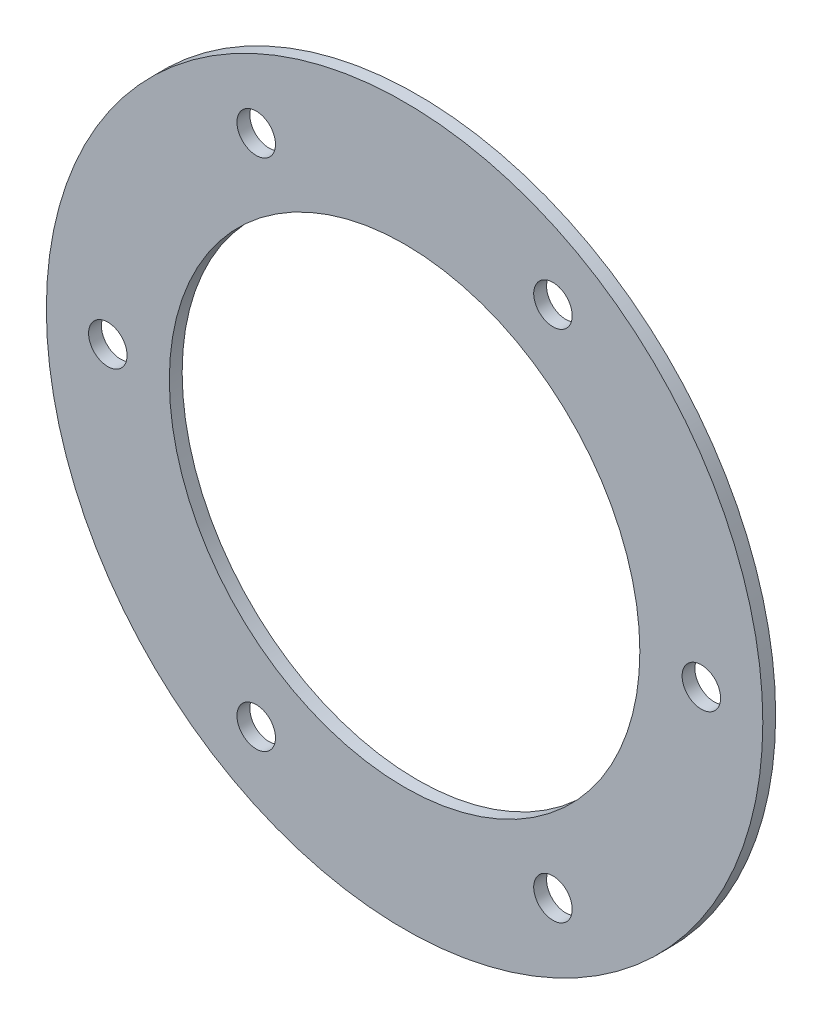
ISO-10303-21;
HEADER;
FILE_DESCRIPTION(('STEP AP214'),'2;1');
FILE_NAME('part.step','',(''),(''),'','','');
FILE_SCHEMA(('AUTOMOTIVE_DESIGN { 1 0 10303 214 1 1 1 1 }'));
ENDSEC;
DATA;
#1=APPLICATION_CONTEXT('core data for automotive mechanical design processes');
#2=APPLICATION_PROTOCOL_DEFINITION('international standard','automotive_design',2000,#1);
#3=PRODUCT_CONTEXT('',#1,'mechanical');
#4=PRODUCT('Part','Part','',(#3));
#5=PRODUCT_RELATED_PRODUCT_CATEGORY('part','',(#4));
#6=PRODUCT_DEFINITION_FORMATION('','',#4);
#7=PRODUCT_DEFINITION_CONTEXT('part definition',#1,'design');
#8=PRODUCT_DEFINITION('design','',#6,#7);
#9=PRODUCT_DEFINITION_SHAPE('','',#8);
#10=(LENGTH_UNIT() NAMED_UNIT(*) SI_UNIT(.MILLI.,.METRE.));
#11=(NAMED_UNIT(*) PLANE_ANGLE_UNIT() SI_UNIT($,.RADIAN.));
#12=(NAMED_UNIT(*) SI_UNIT($,.STERADIAN.) SOLID_ANGLE_UNIT());
#13=UNCERTAINTY_MEASURE_WITH_UNIT(LENGTH_MEASURE(1.E-05),#10,'distance_accuracy_value','');
#14=(GEOMETRIC_REPRESENTATION_CONTEXT(3) GLOBAL_UNCERTAINTY_ASSIGNED_CONTEXT((#13)) GLOBAL_UNIT_ASSIGNED_CONTEXT((#10,
#11,#12)) REPRESENTATION_CONTEXT('',''));
#15=CARTESIAN_POINT('',(0.,0.,0.));
#16=DIRECTION('',(0.,0.,1.));
#17=DIRECTION('',(1.,0.,0.));
#18=AXIS2_PLACEMENT_3D('',#15,#16,#17);
#19=CARTESIAN_POINT('',(0.,0.,6.));
#20=DIRECTION('',(0.,0.,1.));
#21=DIRECTION('',(1.,0.,0.));
#22=AXIS2_PLACEMENT_3D('',#19,#20,#21);
#23=PLANE('',#22);
#24=CARTESIAN_POINT('',(-138.75,7.84203431358765E-13,6.));
#25=DIRECTION('',(0.,0.,1.));
#26=DIRECTION('',(1.,0.,0.));
#27=AXIS2_PLACEMENT_3D('',#24,#25,#26);
#28=CIRCLE('',#27,9.00000000000001);
#29=CARTESIAN_POINT('',(-129.75,7.84203431358765E-13,6.));
#30=VERTEX_POINT('',#29);
#31=EDGE_CURVE('E66',#30,#30,#28,.T.);
#32=ORIENTED_EDGE('',*,*,#31,.F.);
#33=EDGE_LOOP('',(#32));
#34=FACE_BOUND('',#33,.T.);
#35=CARTESIAN_POINT('',(-69.3750000000006,-120.161024775091,6.));
#36=DIRECTION('',(0.,0.,1.));
#37=DIRECTION('',(1.,0.,0.));
#38=AXIS2_PLACEMENT_3D('',#35,#36,#37);
#39=CIRCLE('',#38,9.00000000000001);
#40=CARTESIAN_POINT('',(-60.3750000000006,-120.161024775091,6.));
#41=VERTEX_POINT('',#40);
#42=EDGE_CURVE('E72',#41,#41,#39,.T.);
#43=ORIENTED_EDGE('',*,*,#42,.F.);
#44=EDGE_LOOP('',(#43));
#45=FACE_BOUND('',#44,.T.);
#46=CARTESIAN_POINT('',(69.3749999999993,-120.161024775091,6.));
#47=DIRECTION('',(0.,0.,1.));
#48=DIRECTION('',(1.,0.,0.));
#49=AXIS2_PLACEMENT_3D('',#46,#47,#48);
#50=CIRCLE('',#49,9.00000000000001);
#51=CARTESIAN_POINT('',(78.3749999999993,-120.161024775091,6.));
#52=VERTEX_POINT('',#51);
#53=EDGE_CURVE('E78',#52,#52,#50,.T.);
#54=ORIENTED_EDGE('',*,*,#53,.F.);
#55=EDGE_LOOP('',(#54));
#56=FACE_BOUND('',#55,.T.);
#57=CARTESIAN_POINT('',(138.75,-7.51243685315206E-13,6.));
#58=DIRECTION('',(0.,0.,1.));
#59=DIRECTION('',(1.,0.,0.));
#60=AXIS2_PLACEMENT_3D('',#57,#58,#59);
#61=CIRCLE('',#60,9.00000000000004);
#62=CARTESIAN_POINT('',(147.75,-7.51243685315206E-13,6.));
#63=VERTEX_POINT('',#62);
#64=EDGE_CURVE('E84',#63,#63,#61,.T.);
#65=ORIENTED_EDGE('',*,*,#64,.F.);
#66=EDGE_LOOP('',(#65));
#67=FACE_BOUND('',#66,.T.);
#68=CARTESIAN_POINT('',(69.3750000000007,120.16102477509,6.));
#69=DIRECTION('',(0.,0.,1.));
#70=DIRECTION('',(1.,0.,0.));
#71=AXIS2_PLACEMENT_3D('',#68,#69,#70);
#72=CIRCLE('',#71,8.99999999999999);
#73=CARTESIAN_POINT('',(78.3750000000007,120.16102477509,6.));
#74=VERTEX_POINT('',#73);
#75=EDGE_CURVE('E90',#74,#74,#72,.T.);
#76=ORIENTED_EDGE('',*,*,#75,.F.);
#77=EDGE_LOOP('',(#76));
#78=FACE_BOUND('',#77,.T.);
#79=CARTESIAN_POINT('',(-69.3749999999993,120.161024775091,6.));
#80=DIRECTION('',(0.,0.,1.));
#81=DIRECTION('',(1.,0.,0.));
#82=AXIS2_PLACEMENT_3D('',#79,#80,#81);
#83=CIRCLE('',#82,9.00000000000001);
#84=CARTESIAN_POINT('',(-60.3749999999993,120.161024775091,6.));
#85=VERTEX_POINT('',#84);
#86=EDGE_CURVE('E60',#85,#85,#83,.T.);
#87=ORIENTED_EDGE('',*,*,#86,.F.);
#88=EDGE_LOOP('',(#87));
#89=FACE_BOUND('',#88,.T.);
#90=CARTESIAN_POINT('',(0.,0.,6.));
#91=DIRECTION('',(0.,0.,1.));
#92=DIRECTION('',(1.,0.,0.));
#93=AXIS2_PLACEMENT_3D('',#90,#91,#92);
#94=CIRCLE('',#93,167.5);
#95=CARTESIAN_POINT('',(167.5,0.,6.));
#96=VERTEX_POINT('',#95);
#97=EDGE_CURVE('E10',#96,#96,#94,.T.);
#98=ORIENTED_EDGE('',*,*,#97,.T.);
#99=EDGE_LOOP('',(#98));
#100=FACE_BOUND('',#99,.T.);
#101=CARTESIAN_POINT('',(0.,0.,6.));
#102=DIRECTION('',(0.,0.,1.));
#103=DIRECTION('',(1.,0.,0.));
#104=AXIS2_PLACEMENT_3D('',#101,#102,#103);
#105=CIRCLE('',#104,110.);
#106=CARTESIAN_POINT('',(110.,0.,6.));
#107=VERTEX_POINT('',#106);
#108=EDGE_CURVE('E52',#107,#107,#105,.T.);
#109=ORIENTED_EDGE('',*,*,#108,.F.);
#110=EDGE_LOOP('',(#109));
#111=FACE_BOUND('',#110,.T.);
#112=ADVANCED_FACE('F41',(#34,#45,#56,#67,#78,#89,#100,#111),#23,.T.);
#113=CARTESIAN_POINT('',(0.,0.,0.));
#114=DIRECTION('',(0.,0.,1.));
#115=DIRECTION('',(1.,0.,0.));
#116=AXIS2_PLACEMENT_3D('',#113,#114,#115);
#117=PLANE('',#116);
#118=CARTESIAN_POINT('',(-138.75,7.84203431358765E-13,0.));
#119=DIRECTION('',(0.,0.,1.));
#120=DIRECTION('',(1.,0.,0.));
#121=AXIS2_PLACEMENT_3D('',#118,#119,#120);
#122=CIRCLE('',#121,9.00000000000001);
#123=CARTESIAN_POINT('',(-129.75,7.84203431358765E-13,0.));
#124=VERTEX_POINT('',#123);
#125=EDGE_CURVE('E69',#124,#124,#122,.T.);
#126=ORIENTED_EDGE('',*,*,#125,.T.);
#127=EDGE_LOOP('',(#126));
#128=FACE_BOUND('',#127,.T.);
#129=CARTESIAN_POINT('',(-69.3750000000006,-120.161024775091,0.));
#130=DIRECTION('',(0.,0.,1.));
#131=DIRECTION('',(1.,0.,0.));
#132=AXIS2_PLACEMENT_3D('',#129,#130,#131);
#133=CIRCLE('',#132,9.00000000000001);
#134=CARTESIAN_POINT('',(-60.3750000000006,-120.161024775091,0.));
#135=VERTEX_POINT('',#134);
#136=EDGE_CURVE('E75',#135,#135,#133,.T.);
#137=ORIENTED_EDGE('',*,*,#136,.T.);
#138=EDGE_LOOP('',(#137));
#139=FACE_BOUND('',#138,.T.);
#140=CARTESIAN_POINT('',(69.3749999999993,-120.161024775091,0.));
#141=DIRECTION('',(0.,0.,1.));
#142=DIRECTION('',(1.,0.,0.));
#143=AXIS2_PLACEMENT_3D('',#140,#141,#142);
#144=CIRCLE('',#143,9.00000000000001);
#145=CARTESIAN_POINT('',(78.3749999999993,-120.161024775091,0.));
#146=VERTEX_POINT('',#145);
#147=EDGE_CURVE('E81',#146,#146,#144,.T.);
#148=ORIENTED_EDGE('',*,*,#147,.T.);
#149=EDGE_LOOP('',(#148));
#150=FACE_BOUND('',#149,.T.);
#151=CARTESIAN_POINT('',(138.75,-7.51243685315206E-13,0.));
#152=DIRECTION('',(0.,0.,1.));
#153=DIRECTION('',(1.,0.,0.));
#154=AXIS2_PLACEMENT_3D('',#151,#152,#153);
#155=CIRCLE('',#154,9.00000000000004);
#156=CARTESIAN_POINT('',(147.75,-7.51243685315206E-13,0.));
#157=VERTEX_POINT('',#156);
#158=EDGE_CURVE('E87',#157,#157,#155,.T.);
#159=ORIENTED_EDGE('',*,*,#158,.T.);
#160=EDGE_LOOP('',(#159));
#161=FACE_BOUND('',#160,.T.);
#162=CARTESIAN_POINT('',(69.3750000000007,120.16102477509,0.));
#163=DIRECTION('',(0.,0.,1.));
#164=DIRECTION('',(1.,0.,0.));
#165=AXIS2_PLACEMENT_3D('',#162,#163,#164);
#166=CIRCLE('',#165,8.99999999999999);
#167=CARTESIAN_POINT('',(78.3750000000007,120.16102477509,0.));
#168=VERTEX_POINT('',#167);
#169=EDGE_CURVE('E63',#168,#168,#166,.T.);
#170=ORIENTED_EDGE('',*,*,#169,.T.);
#171=EDGE_LOOP('',(#170));
#172=FACE_BOUND('',#171,.T.);
#173=CARTESIAN_POINT('',(-69.3749999999993,120.161024775091,0.));
#174=DIRECTION('',(0.,0.,1.));
#175=DIRECTION('',(1.,0.,0.));
#176=AXIS2_PLACEMENT_3D('',#173,#174,#175);
#177=CIRCLE('',#176,9.00000000000001);
#178=CARTESIAN_POINT('',(-60.3749999999993,120.161024775091,0.));
#179=VERTEX_POINT('',#178);
#180=EDGE_CURVE('E57',#179,#179,#177,.T.);
#181=ORIENTED_EDGE('',*,*,#180,.T.);
#182=EDGE_LOOP('',(#181));
#183=FACE_BOUND('',#182,.T.);
#184=CARTESIAN_POINT('',(0.,0.,0.));
#185=DIRECTION('',(0.,0.,1.));
#186=DIRECTION('',(1.,0.,0.));
#187=AXIS2_PLACEMENT_3D('',#184,#185,#186);
#188=CIRCLE('',#187,167.5);
#189=CARTESIAN_POINT('',(167.5,0.,0.));
#190=VERTEX_POINT('',#189);
#191=EDGE_CURVE('E45',#190,#190,#188,.T.);
#192=ORIENTED_EDGE('',*,*,#191,.F.);
#193=EDGE_LOOP('',(#192));
#194=FACE_BOUND('',#193,.T.);
#195=CARTESIAN_POINT('',(0.,0.,0.));
#196=DIRECTION('',(0.,0.,1.));
#197=DIRECTION('',(1.,0.,0.));
#198=AXIS2_PLACEMENT_3D('',#195,#196,#197);
#199=CIRCLE('',#198,110.);
#200=CARTESIAN_POINT('',(110.,0.,0.));
#201=VERTEX_POINT('',#200);
#202=EDGE_CURVE('E54',#201,#201,#199,.T.);
#203=ORIENTED_EDGE('',*,*,#202,.T.);
#204=EDGE_LOOP('',(#203));
#205=FACE_BOUND('',#204,.T.);
#206=ADVANCED_FACE('F96',(#128,#139,#150,#161,#172,#183,#194,#205),#117,.F.);
#207=CARTESIAN_POINT('',(0.,0.,6.));
#208=DIRECTION('',(0.,0.,-1.));
#209=DIRECTION('',(-1.,0.,0.));
#210=AXIS2_PLACEMENT_3D('',#207,#208,#209);
#211=CYLINDRICAL_SURFACE('',#210,167.5);
#212=ORIENTED_EDGE('',*,*,#97,.F.);
#213=EDGE_LOOP('',(#212));
#214=FACE_BOUND('',#213,.T.);
#215=ORIENTED_EDGE('',*,*,#191,.T.);
#216=EDGE_LOOP('',(#215));
#217=FACE_BOUND('',#216,.T.);
#218=ADVANCED_FACE('F43',(#214,#217),#211,.T.);
#219=CARTESIAN_POINT('',(0.,0.,6.));
#220=DIRECTION('',(0.,0.,-1.));
#221=DIRECTION('',(-1.,0.,0.));
#222=AXIS2_PLACEMENT_3D('',#219,#220,#221);
#223=CYLINDRICAL_SURFACE('',#222,110.);
#224=ORIENTED_EDGE('',*,*,#108,.T.);
#225=EDGE_LOOP('',(#224));
#226=FACE_BOUND('',#225,.T.);
#227=ORIENTED_EDGE('',*,*,#202,.F.);
#228=EDGE_LOOP('',(#227));
#229=FACE_BOUND('',#228,.T.);
#230=ADVANCED_FACE('F115',(#226,#229),#223,.F.);
#231=CARTESIAN_POINT('',(-69.3749999999993,120.161024775091,0.));
#232=DIRECTION('',(0.,0.,1.));
#233=DIRECTION('',(1.,0.,0.));
#234=AXIS2_PLACEMENT_3D('',#231,#232,#233);
#235=CYLINDRICAL_SURFACE('',#234,9.00000000000001);
#236=ORIENTED_EDGE('',*,*,#180,.F.);
#237=EDGE_LOOP('',(#236));
#238=FACE_BOUND('',#237,.T.);
#239=ORIENTED_EDGE('',*,*,#86,.T.);
#240=EDGE_LOOP('',(#239));
#241=FACE_BOUND('',#240,.T.);
#242=ADVANCED_FACE('F103',(#238,#241),#235,.F.);
#243=CARTESIAN_POINT('',(69.3750000000007,120.16102477509,0.));
#244=DIRECTION('',(0.,0.,1.));
#245=DIRECTION('',(1.,0.,0.));
#246=AXIS2_PLACEMENT_3D('',#243,#244,#245);
#247=CYLINDRICAL_SURFACE('',#246,8.99999999999999);
#248=ORIENTED_EDGE('',*,*,#169,.F.);
#249=EDGE_LOOP('',(#248));
#250=FACE_BOUND('',#249,.T.);
#251=ORIENTED_EDGE('',*,*,#75,.T.);
#252=EDGE_LOOP('',(#251));
#253=FACE_BOUND('',#252,.T.);
#254=ADVANCED_FACE('F99',(#250,#253),#247,.F.);
#255=CARTESIAN_POINT('',(138.75,-7.51243685315206E-13,0.));
#256=DIRECTION('',(0.,0.,1.));
#257=DIRECTION('',(1.,0.,0.));
#258=AXIS2_PLACEMENT_3D('',#255,#256,#257);
#259=CYLINDRICAL_SURFACE('',#258,9.00000000000004);
#260=ORIENTED_EDGE('',*,*,#158,.F.);
#261=EDGE_LOOP('',(#260));
#262=FACE_BOUND('',#261,.T.);
#263=ORIENTED_EDGE('',*,*,#64,.T.);
#264=EDGE_LOOP('',(#263));
#265=FACE_BOUND('',#264,.T.);
#266=ADVANCED_FACE('F102',(#262,#265),#259,.F.);
#267=CARTESIAN_POINT('',(69.3749999999993,-120.161024775091,0.));
#268=DIRECTION('',(0.,0.,1.));
#269=DIRECTION('',(1.,0.,0.));
#270=AXIS2_PLACEMENT_3D('',#267,#268,#269);
#271=CYLINDRICAL_SURFACE('',#270,9.00000000000001);
#272=ORIENTED_EDGE('',*,*,#147,.F.);
#273=EDGE_LOOP('',(#272));
#274=FACE_BOUND('',#273,.T.);
#275=ORIENTED_EDGE('',*,*,#53,.T.);
#276=EDGE_LOOP('',(#275));
#277=FACE_BOUND('',#276,.T.);
#278=ADVANCED_FACE('F139',(#274,#277),#271,.F.);
#279=CARTESIAN_POINT('',(-69.3750000000006,-120.161024775091,0.));
#280=DIRECTION('',(0.,0.,1.));
#281=DIRECTION('',(1.,0.,0.));
#282=AXIS2_PLACEMENT_3D('',#279,#280,#281);
#283=CYLINDRICAL_SURFACE('',#282,9.00000000000001);
#284=ORIENTED_EDGE('',*,*,#136,.F.);
#285=EDGE_LOOP('',(#284));
#286=FACE_BOUND('',#285,.T.);
#287=ORIENTED_EDGE('',*,*,#42,.T.);
#288=EDGE_LOOP('',(#287));
#289=FACE_BOUND('',#288,.T.);
#290=ADVANCED_FACE('F135',(#286,#289),#283,.F.);
#291=CARTESIAN_POINT('',(-138.75,7.84203431358765E-13,0.));
#292=DIRECTION('',(0.,0.,1.));
#293=DIRECTION('',(1.,0.,0.));
#294=AXIS2_PLACEMENT_3D('',#291,#292,#293);
#295=CYLINDRICAL_SURFACE('',#294,9.00000000000001);
#296=ORIENTED_EDGE('',*,*,#125,.F.);
#297=EDGE_LOOP('',(#296));
#298=FACE_BOUND('',#297,.T.);
#299=ORIENTED_EDGE('',*,*,#31,.T.);
#300=EDGE_LOOP('',(#299));
#301=FACE_BOUND('',#300,.T.);
#302=ADVANCED_FACE('F132',(#298,#301),#295,.F.);
#303=CLOSED_SHELL('',(#112,#206,#218,#230,#242,#254,#266,#278,#290,#302));
#304=MANIFOLD_SOLID_BREP('B2',#303);
#305=ADVANCED_BREP_SHAPE_REPRESENTATION('',(#18,#304),#14);
#306=SHAPE_DEFINITION_REPRESENTATION(#9,#305);
ENDSEC;
END-ISO-10303-21;
